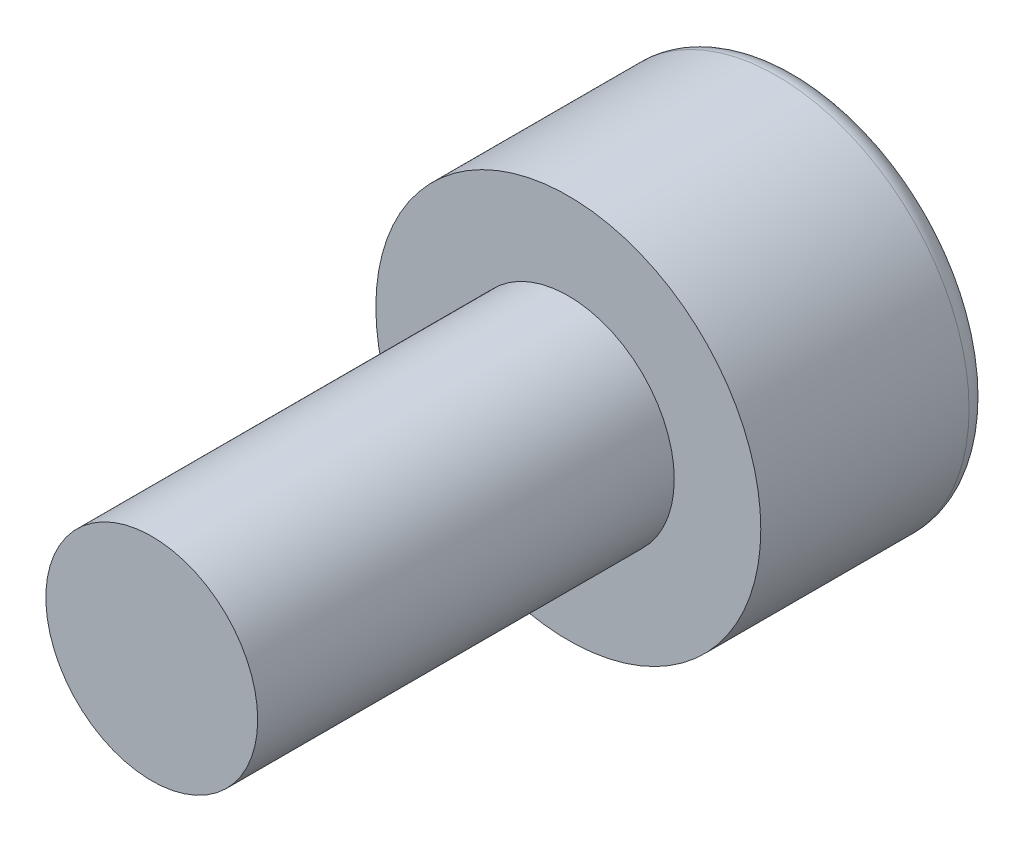
ISO-10303-21;
HEADER;
FILE_DESCRIPTION(('STEP AP214'),'2;1');
FILE_NAME('part.step','',(''),(''),'','','');
FILE_SCHEMA(('AUTOMOTIVE_DESIGN { 1 0 10303 214 1 1 1 1 }'));
ENDSEC;
DATA;
#1=APPLICATION_CONTEXT('core data for automotive mechanical design processes');
#2=APPLICATION_PROTOCOL_DEFINITION('international standard','automotive_design',2000,#1);
#3=PRODUCT_CONTEXT('',#1,'mechanical');
#4=PRODUCT('Part','Part','',(#3));
#5=PRODUCT_RELATED_PRODUCT_CATEGORY('part','',(#4));
#6=PRODUCT_DEFINITION_FORMATION('','',#4);
#7=PRODUCT_DEFINITION_CONTEXT('part definition',#1,'design');
#8=PRODUCT_DEFINITION('design','',#6,#7);
#9=PRODUCT_DEFINITION_SHAPE('','',#8);
#10=(LENGTH_UNIT() NAMED_UNIT(*) SI_UNIT(.MILLI.,.METRE.));
#11=(NAMED_UNIT(*) PLANE_ANGLE_UNIT() SI_UNIT($,.RADIAN.));
#12=(NAMED_UNIT(*) SI_UNIT($,.STERADIAN.) SOLID_ANGLE_UNIT());
#13=UNCERTAINTY_MEASURE_WITH_UNIT(LENGTH_MEASURE(1.E-05),#10,'distance_accuracy_value','');
#14=(GEOMETRIC_REPRESENTATION_CONTEXT(3) GLOBAL_UNCERTAINTY_ASSIGNED_CONTEXT((#13)) GLOBAL_UNIT_ASSIGNED_CONTEXT((#10,
#11,#12)) REPRESENTATION_CONTEXT('',''));
#15=CARTESIAN_POINT('',(0.,0.,0.));
#16=DIRECTION('',(0.,0.,1.));
#17=DIRECTION('',(1.,0.,0.));
#18=AXIS2_PLACEMENT_3D('',#15,#16,#17);
#19=CARTESIAN_POINT('',(0.,0.,5.8));
#20=DIRECTION('',(0.,0.,-1.));
#21=DIRECTION('',(-1.,0.,0.));
#22=AXIS2_PLACEMENT_3D('',#19,#20,#21);
#23=CYLINDRICAL_SURFACE('',#22,1.475);
#24=CARTESIAN_POINT('',(0.,0.,5.8));
#25=DIRECTION('',(0.,0.,1.));
#26=DIRECTION('',(1.,0.,0.));
#27=AXIS2_PLACEMENT_3D('',#24,#25,#26);
#28=CIRCLE('',#27,1.475);
#29=CARTESIAN_POINT('',(1.475,0.,5.8));
#30=VERTEX_POINT('',#29);
#31=EDGE_CURVE('E168',#30,#30,#28,.T.);
#32=ORIENTED_EDGE('',*,*,#31,.F.);
#33=EDGE_LOOP('',(#32));
#34=FACE_BOUND('',#33,.T.);
#35=CARTESIAN_POINT('',(0.,0.,0.));
#36=DIRECTION('',(0.,0.,1.));
#37=DIRECTION('',(1.,0.,0.));
#38=AXIS2_PLACEMENT_3D('',#35,#36,#37);
#39=CIRCLE('',#38,1.475);
#40=CARTESIAN_POINT('',(1.475,0.,0.));
#41=VERTEX_POINT('',#40);
#42=EDGE_CURVE('E167',#41,#41,#39,.T.);
#43=ORIENTED_EDGE('',*,*,#42,.T.);
#44=EDGE_LOOP('',(#43));
#45=FACE_BOUND('',#44,.T.);
#46=ADVANCED_FACE('F39',(#34,#45),#23,.T.);
#47=CARTESIAN_POINT('',(0.,0.,5.8));
#48=DIRECTION('',(0.,0.,1.));
#49=DIRECTION('',(1.,0.,0.));
#50=AXIS2_PLACEMENT_3D('',#47,#48,#49);
#51=PLANE('',#50);
#52=ORIENTED_EDGE('',*,*,#31,.T.);
#53=EDGE_LOOP('',(#52));
#54=FACE_BOUND('',#53,.T.);
#55=ADVANCED_FACE('F190',(#54),#51,.T.);
#56=CARTESIAN_POINT('',(0.,0.,-3.2));
#57=DIRECTION('',(0.,0.,1.));
#58=DIRECTION('',(1.,0.,0.));
#59=AXIS2_PLACEMENT_3D('',#56,#57,#58);
#60=CYLINDRICAL_SURFACE('',#59,2.68);
#61=CARTESIAN_POINT('',(0.,0.,-2.9));
#62=DIRECTION('',(0.,0.,-1.));
#63=DIRECTION('',(-1.,0.,0.));
#64=AXIS2_PLACEMENT_3D('',#61,#62,#63);
#65=CIRCLE('',#64,2.68);
#66=CARTESIAN_POINT('',(-2.68,0.,-2.9));
#67=VERTEX_POINT('',#66);
#68=EDGE_CURVE('E11',#67,#67,#65,.F.);
#69=ORIENTED_EDGE('',*,*,#68,.T.);
#70=EDGE_LOOP('',(#69));
#71=FACE_BOUND('',#70,.T.);
#72=CARTESIAN_POINT('',(0.,0.,0.));
#73=DIRECTION('',(0.,0.,-1.));
#74=DIRECTION('',(-1.,0.,0.));
#75=AXIS2_PLACEMENT_3D('',#72,#73,#74);
#76=CIRCLE('',#75,2.68);
#77=CARTESIAN_POINT('',(-2.68,0.,0.));
#78=VERTEX_POINT('',#77);
#79=EDGE_CURVE('E154',#78,#78,#76,.T.);
#80=ORIENTED_EDGE('',*,*,#79,.T.);
#81=EDGE_LOOP('',(#80));
#82=FACE_BOUND('',#81,.T.);
#83=ADVANCED_FACE('F195',(#71,#82),#60,.T.);
#84=CARTESIAN_POINT('',(0.,0.,-3.2));
#85=DIRECTION('',(0.,0.,-1.));
#86=DIRECTION('',(-1.,0.,0.));
#87=AXIS2_PLACEMENT_3D('',#84,#85,#86);
#88=PLANE('',#87);
#89=CARTESIAN_POINT('',(0.,0.,-3.2));
#90=DIRECTION('',(0.,0.,-1.));
#91=DIRECTION('',(-1.,0.,0.));
#92=AXIS2_PLACEMENT_3D('',#89,#90,#91);
#93=CIRCLE('',#92,2.38);
#94=CARTESIAN_POINT('',(-2.38,0.,-3.2));
#95=VERTEX_POINT('',#94);
#96=EDGE_CURVE('E48',#95,#95,#93,.T.);
#97=ORIENTED_EDGE('',*,*,#96,.T.);
#98=EDGE_LOOP('',(#97));
#99=FACE_BOUND('',#98,.T.);
#100=DIRECTION('',(-0.866025403784442,-0.499999999999995,0.));
#101=VECTOR('',#100,1.);
#102=CARTESIAN_POINT('',(1.5386977701661,-0.888367571806902,-3.2));
#103=LINE('',#102,#101);
#104=CARTESIAN_POINT('',(1.5386977701661,-0.888367571806902,-3.2));
#105=VERTEX_POINT('',#104);
#106=CARTESIAN_POINT('',(0.,-1.77673514361377,-3.2));
#107=VERTEX_POINT('',#106);
#108=EDGE_CURVE('E55',#105,#107,#103,.T.);
#109=ORIENTED_EDGE('',*,*,#108,.F.);
#110=DIRECTION('',(0.,-1.,0.));
#111=VECTOR('',#110,1.);
#112=CARTESIAN_POINT('',(1.53869777016612,0.888367571806869,-3.2));
#113=LINE('',#112,#111);
#114=CARTESIAN_POINT('',(1.53869777016612,0.888367571806869,-3.2));
#115=VERTEX_POINT('',#114);
#116=EDGE_CURVE('E148',#115,#105,#113,.T.);
#117=ORIENTED_EDGE('',*,*,#116,.F.);
#118=DIRECTION('',(0.866025403784435,-0.500000000000007,0.));
#119=VECTOR('',#118,1.);
#120=CARTESIAN_POINT('',(0.,1.77673514361377,-3.2));
#121=LINE('',#120,#119);
#122=CARTESIAN_POINT('',(0.,1.77673514361377,-3.2));
#123=VERTEX_POINT('',#122);
#124=EDGE_CURVE('E145',#123,#115,#121,.T.);
#125=ORIENTED_EDGE('',*,*,#124,.F.);
#126=DIRECTION('',(0.866025403784442,0.499999999999995,0.));
#127=VECTOR('',#126,1.);
#128=CARTESIAN_POINT('',(-1.53869777016611,0.888367571806891,-3.2));
#129=LINE('',#128,#127);
#130=CARTESIAN_POINT('',(-1.53869777016611,0.888367571806891,-3.2));
#131=VERTEX_POINT('',#130);
#132=EDGE_CURVE('E103',#131,#123,#129,.T.);
#133=ORIENTED_EDGE('',*,*,#132,.F.);
#134=DIRECTION('',(0.,1.,0.));
#135=VECTOR('',#134,1.);
#136=CARTESIAN_POINT('',(-1.53869777016612,-0.88836757180688,-3.2));
#137=LINE('',#136,#135);
#138=CARTESIAN_POINT('',(-1.53869777016612,-0.88836757180688,-3.2));
#139=VERTEX_POINT('',#138);
#140=EDGE_CURVE('E139',#139,#131,#137,.T.);
#141=ORIENTED_EDGE('',*,*,#140,.F.);
#142=DIRECTION('',(-0.866025403784438,0.500000000000001,0.));
#143=VECTOR('',#142,1.);
#144=CARTESIAN_POINT('',(0.,-1.77673514361377,-3.2));
#145=LINE('',#144,#143);
#146=EDGE_CURVE('E135',#107,#139,#145,.T.);
#147=ORIENTED_EDGE('',*,*,#146,.F.);
#148=EDGE_LOOP('',(#109,#117,#125,#133,#141,#147));
#149=FACE_BOUND('',#148,.T.);
#150=ADVANCED_FACE('F178',(#99,#149),#88,.T.);
#151=CARTESIAN_POINT('',(0.,0.,0.));
#152=DIRECTION('',(0.,0.,-1.));
#153=DIRECTION('',(-1.,0.,0.));
#154=AXIS2_PLACEMENT_3D('',#151,#152,#153);
#155=PLANE('',#154);
#156=ORIENTED_EDGE('',*,*,#42,.F.);
#157=EDGE_LOOP('',(#156));
#158=FACE_BOUND('',#157,.T.);
#159=ORIENTED_EDGE('',*,*,#79,.F.);
#160=EDGE_LOOP('',(#159));
#161=FACE_BOUND('',#160,.T.);
#162=ADVANCED_FACE('F204',(#158,#161),#155,.F.);
#163=CARTESIAN_POINT('',(1.5386977701661,-0.888367571806902,-0.7));
#164=DIRECTION('',(0.499999999999995,-0.866025403784442,0.));
#165=DIRECTION('',(0.866025403784442,0.499999999999995,0.));
#166=AXIS2_PLACEMENT_3D('',#163,#164,#165);
#167=PLANE('',#166);
#168=ORIENTED_EDGE('',*,*,#108,.T.);
#169=DIRECTION('',(0.,0.,-1.));
#170=VECTOR('',#169,1.);
#171=CARTESIAN_POINT('',(0.,-1.77673514361377,-0.7));
#172=LINE('',#171,#170);
#173=CARTESIAN_POINT('',(0.,-1.77673514361377,-0.7));
#174=VERTEX_POINT('',#173);
#175=EDGE_CURVE('E85',#174,#107,#172,.T.);
#176=ORIENTED_EDGE('',*,*,#175,.F.);
#177=DIRECTION('',(-0.866025403784442,-0.499999999999995,0.));
#178=VECTOR('',#177,1.);
#179=CARTESIAN_POINT('',(1.5386977701661,-0.888367571806902,-0.7));
#180=LINE('',#179,#178);
#181=CARTESIAN_POINT('',(1.5386977701661,-0.888367571806902,-0.7));
#182=VERTEX_POINT('',#181);
#183=EDGE_CURVE('E151',#182,#174,#180,.T.);
#184=ORIENTED_EDGE('',*,*,#183,.F.);
#185=DIRECTION('',(0.,0.,-1.));
#186=VECTOR('',#185,1.);
#187=CARTESIAN_POINT('',(1.5386977701661,-0.888367571806902,-0.7));
#188=LINE('',#187,#186);
#189=EDGE_CURVE('E63',#182,#105,#188,.T.);
#190=ORIENTED_EDGE('',*,*,#189,.T.);
#191=EDGE_LOOP('',(#168,#176,#184,#190));
#192=FACE_BOUND('',#191,.T.);
#193=ADVANCED_FACE('F207',(#192),#167,.F.);
#194=CARTESIAN_POINT('',(1.53869777016612,0.888367571806869,-0.7));
#195=DIRECTION('',(1.,0.,0.));
#196=DIRECTION('',(0.,1.,0.));
#197=AXIS2_PLACEMENT_3D('',#194,#195,#196);
#198=PLANE('',#197);
#199=ORIENTED_EDGE('',*,*,#116,.T.);
#200=ORIENTED_EDGE('',*,*,#189,.F.);
#201=DIRECTION('',(0.,-1.,0.));
#202=VECTOR('',#201,1.);
#203=CARTESIAN_POINT('',(1.53869777016612,0.888367571806869,-0.7));
#204=LINE('',#203,#202);
#205=CARTESIAN_POINT('',(1.53869777016612,0.888367571806869,-0.7));
#206=VERTEX_POINT('',#205);
#207=EDGE_CURVE('E117',#206,#182,#204,.T.);
#208=ORIENTED_EDGE('',*,*,#207,.F.);
#209=DIRECTION('',(0.,0.,-1.));
#210=VECTOR('',#209,1.);
#211=CARTESIAN_POINT('',(1.53869777016612,0.888367571806869,-0.7));
#212=LINE('',#211,#210);
#213=EDGE_CURVE('E108',#206,#115,#212,.T.);
#214=ORIENTED_EDGE('',*,*,#213,.T.);
#215=EDGE_LOOP('',(#199,#200,#208,#214));
#216=FACE_BOUND('',#215,.T.);
#217=ADVANCED_FACE('F213',(#216),#198,.F.);
#218=CARTESIAN_POINT('',(0.,1.77673514361377,-0.7));
#219=DIRECTION('',(0.500000000000007,0.866025403784435,0.));
#220=DIRECTION('',(-0.866025403784435,0.500000000000007,0.));
#221=AXIS2_PLACEMENT_3D('',#218,#219,#220);
#222=PLANE('',#221);
#223=ORIENTED_EDGE('',*,*,#124,.T.);
#224=ORIENTED_EDGE('',*,*,#213,.F.);
#225=DIRECTION('',(0.866025403784435,-0.500000000000007,0.));
#226=VECTOR('',#225,1.);
#227=CARTESIAN_POINT('',(0.,1.77673514361377,-0.7));
#228=LINE('',#227,#226);
#229=CARTESIAN_POINT('',(0.,1.77673514361377,-0.7));
#230=VERTEX_POINT('',#229);
#231=EDGE_CURVE('E112',#230,#206,#228,.T.);
#232=ORIENTED_EDGE('',*,*,#231,.F.);
#233=DIRECTION('',(0.,0.,-1.));
#234=VECTOR('',#233,1.);
#235=CARTESIAN_POINT('',(0.,1.77673514361377,-0.7));
#236=LINE('',#235,#234);
#237=EDGE_CURVE('E96',#230,#123,#236,.T.);
#238=ORIENTED_EDGE('',*,*,#237,.T.);
#239=EDGE_LOOP('',(#223,#224,#232,#238));
#240=FACE_BOUND('',#239,.T.);
#241=ADVANCED_FACE('F113',(#240),#222,.F.);
#242=CARTESIAN_POINT('',(-1.53869777016611,0.888367571806891,-0.7));
#243=DIRECTION('',(-0.499999999999995,0.866025403784442,0.));
#244=DIRECTION('',(-0.866025403784442,-0.499999999999995,0.));
#245=AXIS2_PLACEMENT_3D('',#242,#243,#244);
#246=PLANE('',#245);
#247=ORIENTED_EDGE('',*,*,#132,.T.);
#248=ORIENTED_EDGE('',*,*,#237,.F.);
#249=DIRECTION('',(0.866025403784442,0.499999999999995,0.));
#250=VECTOR('',#249,1.);
#251=CARTESIAN_POINT('',(-1.53869777016611,0.888367571806891,-0.7));
#252=LINE('',#251,#250);
#253=CARTESIAN_POINT('',(-1.53869777016611,0.888367571806891,-0.7));
#254=VERTEX_POINT('',#253);
#255=EDGE_CURVE('E100',#254,#230,#252,.T.);
#256=ORIENTED_EDGE('',*,*,#255,.F.);
#257=DIRECTION('',(0.,0.,-1.));
#258=VECTOR('',#257,1.);
#259=CARTESIAN_POINT('',(-1.53869777016611,0.888367571806891,-0.7));
#260=LINE('',#259,#258);
#261=EDGE_CURVE('E109',#254,#131,#260,.T.);
#262=ORIENTED_EDGE('',*,*,#261,.T.);
#263=EDGE_LOOP('',(#247,#248,#256,#262));
#264=FACE_BOUND('',#263,.T.);
#265=ADVANCED_FACE('F98',(#264),#246,.F.);
#266=CARTESIAN_POINT('',(-1.53869777016612,-0.88836757180688,-0.7));
#267=DIRECTION('',(-1.,0.,0.));
#268=DIRECTION('',(0.,-1.,0.));
#269=AXIS2_PLACEMENT_3D('',#266,#267,#268);
#270=PLANE('',#269);
#271=ORIENTED_EDGE('',*,*,#140,.T.);
#272=ORIENTED_EDGE('',*,*,#261,.F.);
#273=DIRECTION('',(0.,1.,0.));
#274=VECTOR('',#273,1.);
#275=CARTESIAN_POINT('',(-1.53869777016612,-0.88836757180688,-0.7));
#276=LINE('',#275,#274);
#277=CARTESIAN_POINT('',(-1.53869777016612,-0.88836757180688,-0.7));
#278=VERTEX_POINT('',#277);
#279=EDGE_CURVE('E123',#278,#254,#276,.T.);
#280=ORIENTED_EDGE('',*,*,#279,.F.);
#281=DIRECTION('',(0.,0.,-1.));
#282=VECTOR('',#281,1.);
#283=CARTESIAN_POINT('',(-1.53869777016612,-0.88836757180688,-0.7));
#284=LINE('',#283,#282);
#285=EDGE_CURVE('E159',#278,#139,#284,.T.);
#286=ORIENTED_EDGE('',*,*,#285,.T.);
#287=EDGE_LOOP('',(#271,#272,#280,#286));
#288=FACE_BOUND('',#287,.T.);
#289=ADVANCED_FACE('F216',(#288),#270,.F.);
#290=CARTESIAN_POINT('',(0.,-1.77673514361377,-0.7));
#291=DIRECTION('',(-0.500000000000001,-0.866025403784438,0.));
#292=DIRECTION('',(0.866025403784438,-0.500000000000001,0.));
#293=AXIS2_PLACEMENT_3D('',#290,#291,#292);
#294=PLANE('',#293);
#295=ORIENTED_EDGE('',*,*,#146,.T.);
#296=ORIENTED_EDGE('',*,*,#285,.F.);
#297=DIRECTION('',(-0.866025403784438,0.500000000000001,0.));
#298=VECTOR('',#297,1.);
#299=CARTESIAN_POINT('',(0.,-1.77673514361377,-0.7));
#300=LINE('',#299,#298);
#301=EDGE_CURVE('E127',#174,#278,#300,.T.);
#302=ORIENTED_EDGE('',*,*,#301,.F.);
#303=ORIENTED_EDGE('',*,*,#175,.T.);
#304=EDGE_LOOP('',(#295,#296,#302,#303));
#305=FACE_BOUND('',#304,.T.);
#306=ADVANCED_FACE('F186',(#305),#294,.F.);
#307=CARTESIAN_POINT('',(0.,0.,-0.7));
#308=DIRECTION('',(0.,0.,-1.));
#309=DIRECTION('',(-1.,0.,0.));
#310=AXIS2_PLACEMENT_3D('',#307,#308,#309);
#311=PLANE('',#310);
#312=ORIENTED_EDGE('',*,*,#183,.T.);
#313=ORIENTED_EDGE('',*,*,#301,.T.);
#314=ORIENTED_EDGE('',*,*,#279,.T.);
#315=ORIENTED_EDGE('',*,*,#255,.T.);
#316=ORIENTED_EDGE('',*,*,#231,.T.);
#317=ORIENTED_EDGE('',*,*,#207,.T.);
#318=EDGE_LOOP('',(#312,#313,#314,#315,#316,#317));
#319=FACE_BOUND('',#318,.T.);
#320=ADVANCED_FACE('F120',(#319),#311,.T.);
#321=CARTESIAN_POINT('',(0.,0.,-2.9));
#322=DIRECTION('',(0.,0.,-1.));
#323=DIRECTION('',(-1.,0.,0.));
#324=AXIS2_PLACEMENT_3D('',#321,#322,#323);
#325=TOROIDAL_SURFACE('',#324,2.38,0.3);
#326=ORIENTED_EDGE('',*,*,#68,.F.);
#327=EDGE_LOOP('',(#326));
#328=FACE_BOUND('',#327,.T.);
#329=ORIENTED_EDGE('',*,*,#96,.F.);
#330=EDGE_LOOP('',(#329));
#331=FACE_BOUND('',#330,.T.);
#332=ADVANCED_FACE('F41',(#328,#331),#325,.T.);
#333=CLOSED_SHELL('',(#46,#55,#83,#150,#162,#193,#217,#241,#265,#289,#306,#320,#332));
#334=MANIFOLD_SOLID_BREP('B2',#333);
#335=ADVANCED_BREP_SHAPE_REPRESENTATION('',(#18,#334),#14);
#336=SHAPE_DEFINITION_REPRESENTATION(#9,#335);
ENDSEC;
END-ISO-10303-21;
